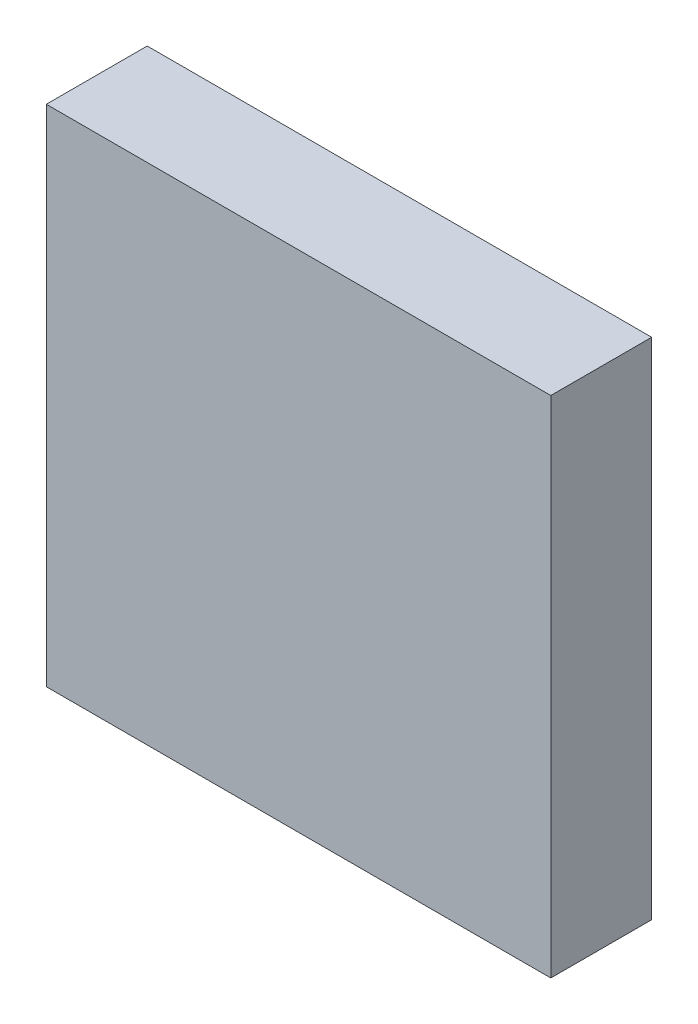
ISO-10303-21;
HEADER;
FILE_DESCRIPTION(('STEP AP214'),'2;1');
FILE_NAME('part.step','',(''),(''),'','','');
FILE_SCHEMA(('AUTOMOTIVE_DESIGN { 1 0 10303 214 1 1 1 1 }'));
ENDSEC;
DATA;
#1=APPLICATION_CONTEXT('core data for automotive mechanical design processes');
#2=APPLICATION_PROTOCOL_DEFINITION('international standard','automotive_design',2000,#1);
#3=PRODUCT_CONTEXT('',#1,'mechanical');
#4=PRODUCT('Part','Part','',(#3));
#5=PRODUCT_RELATED_PRODUCT_CATEGORY('part','',(#4));
#6=PRODUCT_DEFINITION_FORMATION('','',#4);
#7=PRODUCT_DEFINITION_CONTEXT('part definition',#1,'design');
#8=PRODUCT_DEFINITION('design','',#6,#7);
#9=PRODUCT_DEFINITION_SHAPE('','',#8);
#10=(LENGTH_UNIT() NAMED_UNIT(*) SI_UNIT(.MILLI.,.METRE.));
#11=(NAMED_UNIT(*) PLANE_ANGLE_UNIT() SI_UNIT($,.RADIAN.));
#12=(NAMED_UNIT(*) SI_UNIT($,.STERADIAN.) SOLID_ANGLE_UNIT());
#13=UNCERTAINTY_MEASURE_WITH_UNIT(LENGTH_MEASURE(1.E-05),#10,'distance_accuracy_value','');
#14=(GEOMETRIC_REPRESENTATION_CONTEXT(3) GLOBAL_UNCERTAINTY_ASSIGNED_CONTEXT((#13)) GLOBAL_UNIT_ASSIGNED_CONTEXT((#10,
#11,#12)) REPRESENTATION_CONTEXT('',''));
#15=CARTESIAN_POINT('',(0.,0.,0.));
#16=DIRECTION('',(0.,0.,1.));
#17=DIRECTION('',(1.,0.,0.));
#18=AXIS2_PLACEMENT_3D('',#15,#16,#17);
#19=CARTESIAN_POINT('',(0.,0.,5.));
#20=DIRECTION('',(1.,0.,0.));
#21=DIRECTION('',(0.,0.,-1.));
#22=AXIS2_PLACEMENT_3D('',#19,#20,#21);
#23=PLANE('',#22);
#24=DIRECTION('',(0.,-1.,0.));
#25=VECTOR('',#24,1.);
#26=CARTESIAN_POINT('',(0.,0.,0.));
#27=LINE('',#26,#25);
#28=CARTESIAN_POINT('',(0.,25.,0.));
#29=VERTEX_POINT('',#28);
#30=CARTESIAN_POINT('',(0.,0.,0.));
#31=VERTEX_POINT('',#30);
#32=EDGE_CURVE('E107',#29,#31,#27,.T.);
#33=ORIENTED_EDGE('',*,*,#32,.T.);
#34=DIRECTION('',(0.,0.,-1.));
#35=VECTOR('',#34,1.);
#36=CARTESIAN_POINT('',(0.,0.,5.));
#37=LINE('',#36,#35);
#38=CARTESIAN_POINT('',(0.,0.,5.));
#39=VERTEX_POINT('',#38);
#40=EDGE_CURVE('E11',#39,#31,#37,.T.);
#41=ORIENTED_EDGE('',*,*,#40,.F.);
#42=DIRECTION('',(0.,-1.,0.));
#43=VECTOR('',#42,1.);
#44=CARTESIAN_POINT('',(0.,0.,5.));
#45=LINE('',#44,#43);
#46=CARTESIAN_POINT('',(0.,25.,5.));
#47=VERTEX_POINT('',#46);
#48=EDGE_CURVE('E91',#47,#39,#45,.T.);
#49=ORIENTED_EDGE('',*,*,#48,.F.);
#50=DIRECTION('',(0.,0.,-1.));
#51=VECTOR('',#50,1.);
#52=CARTESIAN_POINT('',(0.,25.,5.));
#53=LINE('',#52,#51);
#54=EDGE_CURVE('E103',#47,#29,#53,.T.);
#55=ORIENTED_EDGE('',*,*,#54,.T.);
#56=EDGE_LOOP('',(#33,#41,#49,#55));
#57=FACE_BOUND('',#56,.T.);
#58=ADVANCED_FACE('F39',(#57),#23,.F.);
#59=CARTESIAN_POINT('',(0.,0.,5.));
#60=DIRECTION('',(0.,1.,0.));
#61=DIRECTION('',(0.,0.,1.));
#62=AXIS2_PLACEMENT_3D('',#59,#60,#61);
#63=PLANE('',#62);
#64=DIRECTION('',(1.,0.,0.));
#65=VECTOR('',#64,1.);
#66=CARTESIAN_POINT('',(0.,0.,0.));
#67=LINE('',#66,#65);
#68=CARTESIAN_POINT('',(25.,0.,0.));
#69=VERTEX_POINT('',#68);
#70=EDGE_CURVE('E96',#31,#69,#67,.T.);
#71=ORIENTED_EDGE('',*,*,#70,.T.);
#72=DIRECTION('',(0.,0.,-1.));
#73=VECTOR('',#72,1.);
#74=CARTESIAN_POINT('',(25.,0.,5.));
#75=LINE('',#74,#73);
#76=CARTESIAN_POINT('',(25.,0.,5.));
#77=VERTEX_POINT('',#76);
#78=EDGE_CURVE('E48',#77,#69,#75,.T.);
#79=ORIENTED_EDGE('',*,*,#78,.F.);
#80=DIRECTION('',(1.,0.,0.));
#81=VECTOR('',#80,1.);
#82=CARTESIAN_POINT('',(0.,0.,5.));
#83=LINE('',#82,#81);
#84=EDGE_CURVE('E86',#39,#77,#83,.T.);
#85=ORIENTED_EDGE('',*,*,#84,.F.);
#86=ORIENTED_EDGE('',*,*,#40,.T.);
#87=EDGE_LOOP('',(#71,#79,#85,#86));
#88=FACE_BOUND('',#87,.T.);
#89=ADVANCED_FACE('F95',(#88),#63,.F.);
#90=CARTESIAN_POINT('',(25.,0.,5.));
#91=DIRECTION('',(-1.,0.,0.));
#92=DIRECTION('',(0.,0.,1.));
#93=AXIS2_PLACEMENT_3D('',#90,#91,#92);
#94=PLANE('',#93);
#95=DIRECTION('',(0.,1.,0.));
#96=VECTOR('',#95,1.);
#97=CARTESIAN_POINT('',(25.,0.,0.));
#98=LINE('',#97,#96);
#99=CARTESIAN_POINT('',(25.,25.,0.));
#100=VERTEX_POINT('',#99);
#101=EDGE_CURVE('E73',#69,#100,#98,.T.);
#102=ORIENTED_EDGE('',*,*,#101,.T.);
#103=DIRECTION('',(0.,0.,-1.));
#104=VECTOR('',#103,1.);
#105=CARTESIAN_POINT('',(25.,25.,5.));
#106=LINE('',#105,#104);
#107=CARTESIAN_POINT('',(25.,25.,5.));
#108=VERTEX_POINT('',#107);
#109=EDGE_CURVE('E98',#108,#100,#106,.T.);
#110=ORIENTED_EDGE('',*,*,#109,.F.);
#111=DIRECTION('',(0.,1.,0.));
#112=VECTOR('',#111,1.);
#113=CARTESIAN_POINT('',(25.,0.,5.));
#114=LINE('',#113,#112);
#115=EDGE_CURVE('E89',#77,#108,#114,.T.);
#116=ORIENTED_EDGE('',*,*,#115,.F.);
#117=ORIENTED_EDGE('',*,*,#78,.T.);
#118=EDGE_LOOP('',(#102,#110,#116,#117));
#119=FACE_BOUND('',#118,.T.);
#120=ADVANCED_FACE('F99',(#119),#94,.F.);
#121=CARTESIAN_POINT('',(0.,25.,5.));
#122=DIRECTION('',(0.,-1.,0.));
#123=DIRECTION('',(0.,0.,-1.));
#124=AXIS2_PLACEMENT_3D('',#121,#122,#123);
#125=PLANE('',#124);
#126=DIRECTION('',(-1.,0.,0.));
#127=VECTOR('',#126,1.);
#128=CARTESIAN_POINT('',(0.,25.,0.));
#129=LINE('',#128,#127);
#130=EDGE_CURVE('E79',#100,#29,#129,.T.);
#131=ORIENTED_EDGE('',*,*,#130,.T.);
#132=ORIENTED_EDGE('',*,*,#54,.F.);
#133=DIRECTION('',(-1.,0.,0.));
#134=VECTOR('',#133,1.);
#135=CARTESIAN_POINT('',(0.,25.,5.));
#136=LINE('',#135,#134);
#137=EDGE_CURVE('E56',#108,#47,#136,.T.);
#138=ORIENTED_EDGE('',*,*,#137,.F.);
#139=ORIENTED_EDGE('',*,*,#109,.T.);
#140=EDGE_LOOP('',(#131,#132,#138,#139));
#141=FACE_BOUND('',#140,.T.);
#142=ADVANCED_FACE('F120',(#141),#125,.F.);
#143=CARTESIAN_POINT('',(0.,0.,5.));
#144=DIRECTION('',(0.,0.,-1.));
#145=DIRECTION('',(-1.,0.,0.));
#146=AXIS2_PLACEMENT_3D('',#143,#144,#145);
#147=PLANE('',#146);
#148=ORIENTED_EDGE('',*,*,#48,.T.);
#149=ORIENTED_EDGE('',*,*,#84,.T.);
#150=ORIENTED_EDGE('',*,*,#115,.T.);
#151=ORIENTED_EDGE('',*,*,#137,.T.);
#152=EDGE_LOOP('',(#148,#149,#150,#151));
#153=FACE_BOUND('',#152,.T.);
#154=ADVANCED_FACE('F87',(#153),#147,.F.);
#155=CARTESIAN_POINT('',(0.,0.,0.));
#156=DIRECTION('',(0.,0.,-1.));
#157=DIRECTION('',(-1.,0.,0.));
#158=AXIS2_PLACEMENT_3D('',#155,#156,#157);
#159=PLANE('',#158);
#160=ORIENTED_EDGE('',*,*,#32,.F.);
#161=ORIENTED_EDGE('',*,*,#130,.F.);
#162=ORIENTED_EDGE('',*,*,#101,.F.);
#163=ORIENTED_EDGE('',*,*,#70,.F.);
#164=EDGE_LOOP('',(#160,#161,#162,#163));
#165=FACE_BOUND('',#164,.T.);
#166=ADVANCED_FACE('F123',(#165),#159,.T.);
#167=CLOSED_SHELL('',(#58,#89,#120,#142,#154,#166));
#168=MANIFOLD_SOLID_BREP('B2',#167);
#169=ADVANCED_BREP_SHAPE_REPRESENTATION('',(#18,#168),#14);
#170=SHAPE_DEFINITION_REPRESENTATION(#9,#169);
ENDSEC;
END-ISO-10303-21;
